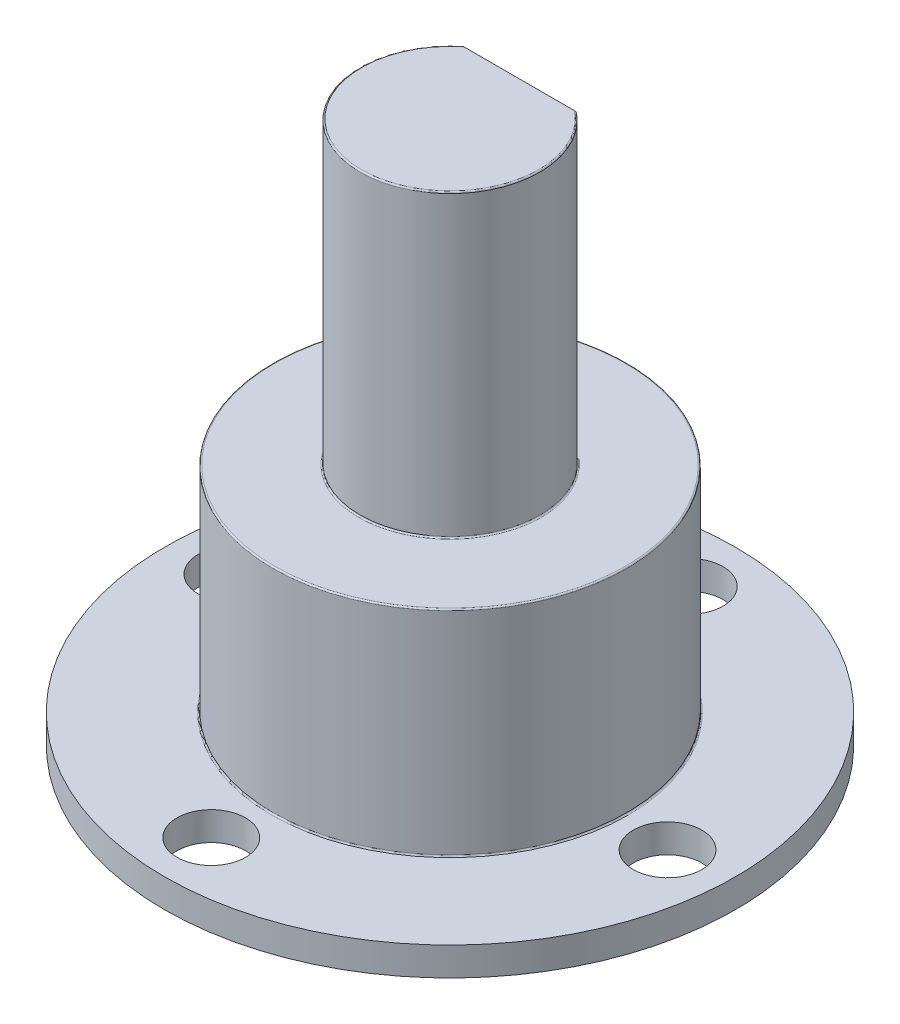
ISO-10303-21;
HEADER;
FILE_DESCRIPTION(('STEP AP214'),'2;1');
FILE_NAME('part.step','',(''),(''),'','','');
FILE_SCHEMA(('AUTOMOTIVE_DESIGN { 1 0 10303 214 1 1 1 1 }'));
ENDSEC;
DATA;
#1=APPLICATION_CONTEXT('core data for automotive mechanical design processes');
#2=APPLICATION_PROTOCOL_DEFINITION('international standard','automotive_design',2000,#1);
#3=PRODUCT_CONTEXT('',#1,'mechanical');
#4=PRODUCT('Part','Part','',(#3));
#5=PRODUCT_RELATED_PRODUCT_CATEGORY('part','',(#4));
#6=PRODUCT_DEFINITION_FORMATION('','',#4);
#7=PRODUCT_DEFINITION_CONTEXT('part definition',#1,'design');
#8=PRODUCT_DEFINITION('design','',#6,#7);
#9=PRODUCT_DEFINITION_SHAPE('','',#8);
#10=(LENGTH_UNIT() NAMED_UNIT(*) SI_UNIT(.MILLI.,.METRE.));
#11=(NAMED_UNIT(*) PLANE_ANGLE_UNIT() SI_UNIT($,.RADIAN.));
#12=(NAMED_UNIT(*) SI_UNIT($,.STERADIAN.) SOLID_ANGLE_UNIT());
#13=UNCERTAINTY_MEASURE_WITH_UNIT(LENGTH_MEASURE(1.E-05),#10,'distance_accuracy_value','');
#14=(GEOMETRIC_REPRESENTATION_CONTEXT(3) GLOBAL_UNCERTAINTY_ASSIGNED_CONTEXT((#13)) GLOBAL_UNIT_ASSIGNED_CONTEXT((#10,
#11,#12)) REPRESENTATION_CONTEXT('',''));
#15=CARTESIAN_POINT('',(0.,0.,0.));
#16=DIRECTION('',(0.,0.,1.));
#17=DIRECTION('',(1.,0.,0.));
#18=AXIS2_PLACEMENT_3D('',#15,#16,#17);
#19=CARTESIAN_POINT('',(0.,19.,0.));
#20=DIRECTION('',(0.,1.,0.));
#21=DIRECTION('',(0.,0.,1.));
#22=AXIS2_PLACEMENT_3D('',#19,#20,#21);
#23=PLANE('',#22);
#24=DIRECTION('',(1.,0.,0.));
#25=VECTOR('',#24,1.);
#26=CARTESIAN_POINT('',(-3.64134224162171,19.,-2.42190413345966));
#27=LINE('',#26,#25);
#28=CARTESIAN_POINT('',(-1.93504014643908,19.,-2.42190413345966));
#29=VERTEX_POINT('',#28);
#30=CARTESIAN_POINT('',(1.93504014643908,19.,-2.42190413345966));
#31=VERTEX_POINT('',#30);
#32=EDGE_CURVE('E197',#29,#31,#27,.T.);
#33=ORIENTED_EDGE('',*,*,#32,.F.);
#34=CARTESIAN_POINT('',(0.,19.,0.));
#35=DIRECTION('',(0.,1.,0.));
#36=DIRECTION('',(0.,0.,1.));
#37=AXIS2_PLACEMENT_3D('',#34,#35,#36);
#38=CIRCLE('',#37,3.1);
#39=EDGE_CURVE('E264',#29,#31,#38,.T.);
#40=ORIENTED_EDGE('',*,*,#39,.T.);
#41=EDGE_LOOP('',(#33,#40));
#42=FACE_BOUND('',#41,.T.);
#43=ADVANCED_FACE('F33',(#42),#23,.T.);
#44=CARTESIAN_POINT('',(0.,5.,0.));
#45=DIRECTION('',(0.,-1.,0.));
#46=DIRECTION('',(0.,0.,-1.));
#47=AXIS2_PLACEMENT_3D('',#44,#45,#46);
#48=CYLINDRICAL_SURFACE('',#47,3.15);
#49=DIRECTION('',(0.,-1.,0.));
#50=VECTOR('',#49,1.);
#51=CARTESIAN_POINT('',(2.01416989559744,5.,-2.42190413345966));
#52=LINE('',#51,#50);
#53=CARTESIAN_POINT('',(2.01416989559744,18.95,-2.42190413345966));
#54=VERTEX_POINT('',#53);
#55=CARTESIAN_POINT('',(2.01416989559744,8.55,-2.42190413345966));
#56=VERTEX_POINT('',#55);
#57=EDGE_CURVE('E91',#54,#56,#52,.T.);
#58=ORIENTED_EDGE('',*,*,#57,.F.);
#59=CARTESIAN_POINT('',(0.,18.95,0.));
#60=DIRECTION('',(0.,1.,0.));
#61=DIRECTION('',(0.,0.,1.));
#62=AXIS2_PLACEMENT_3D('',#59,#60,#61);
#63=CIRCLE('',#62,3.15);
#64=CARTESIAN_POINT('',(-2.01416989559744,18.95,-2.42190413345966));
#65=VERTEX_POINT('',#64);
#66=EDGE_CURVE('E89',#54,#65,#63,.F.);
#67=ORIENTED_EDGE('',*,*,#66,.T.);
#68=DIRECTION('',(0.,-1.,0.));
#69=VECTOR('',#68,1.);
#70=CARTESIAN_POINT('',(-2.01416989559744,5.,-2.42190413345966));
#71=LINE('',#70,#69);
#72=CARTESIAN_POINT('',(-2.01416989559744,8.55,-2.42190413345966));
#73=VERTEX_POINT('',#72);
#74=EDGE_CURVE('E77',#73,#65,#71,.F.);
#75=ORIENTED_EDGE('',*,*,#74,.F.);
#76=CARTESIAN_POINT('',(0.,8.55,0.));
#77=DIRECTION('',(0.,1.,0.));
#78=DIRECTION('',(0.,0.,1.));
#79=AXIS2_PLACEMENT_3D('',#76,#77,#78);
#80=CIRCLE('',#79,3.15);
#81=EDGE_CURVE('E86',#73,#56,#80,.T.);
#82=ORIENTED_EDGE('',*,*,#81,.T.);
#83=EDGE_LOOP('',(#58,#67,#75,#82));
#84=FACE_BOUND('',#83,.T.);
#85=ADVANCED_FACE('F85',(#84),#48,.T.);
#86=CARTESIAN_POINT('',(3.15,8.5,0.));
#87=DIRECTION('',(0.,1.,0.));
#88=DIRECTION('',(0.,0.,1.));
#89=AXIS2_PLACEMENT_3D('',#86,#87,#88);
#90=PLANE('',#89);
#91=CARTESIAN_POINT('',(0.,8.5,0.));
#92=DIRECTION('',(0.,1.,0.));
#93=DIRECTION('',(0.,0.,1.));
#94=AXIS2_PLACEMENT_3D('',#91,#92,#93);
#95=CIRCLE('',#94,6.15);
#96=CARTESIAN_POINT('',(0.,8.5,6.15));
#97=VERTEX_POINT('',#96);
#98=EDGE_CURVE('E265',#97,#97,#95,.T.);
#99=ORIENTED_EDGE('',*,*,#98,.T.);
#100=EDGE_LOOP('',(#99));
#101=FACE_BOUND('',#100,.T.);
#102=CARTESIAN_POINT('',(0.,8.5,0.));
#103=DIRECTION('',(0.,1.,0.));
#104=DIRECTION('',(0.,0.,1.));
#105=AXIS2_PLACEMENT_3D('',#102,#103,#104);
#106=CIRCLE('',#105,3.2);
#107=CARTESIAN_POINT('',(2.09150194079063,8.5,-2.42190413345966));
#108=VERTEX_POINT('',#107);
#109=CARTESIAN_POINT('',(-2.09150194079063,8.5,-2.42190413345966));
#110=VERTEX_POINT('',#109);
#111=EDGE_CURVE('E267',#108,#110,#106,.F.);
#112=ORIENTED_EDGE('',*,*,#111,.T.);
#113=DIRECTION('',(-1.,0.,0.));
#114=VECTOR('',#113,1.);
#115=CARTESIAN_POINT('',(-3.64134224162171,8.5,-2.42190413345966));
#116=LINE('',#115,#114);
#117=EDGE_CURVE('E53',#108,#110,#116,.T.);
#118=ORIENTED_EDGE('',*,*,#117,.F.);
#119=EDGE_LOOP('',(#112,#118));
#120=FACE_BOUND('',#119,.T.);
#121=ADVANCED_FACE('F153',(#101,#120),#90,.T.);
#122=CARTESIAN_POINT('',(0.,5.,0.));
#123=DIRECTION('',(0.,-1.,0.));
#124=DIRECTION('',(0.,0.,-1.));
#125=AXIS2_PLACEMENT_3D('',#122,#123,#124);
#126=CYLINDRICAL_SURFACE('',#125,6.2);
#127=CARTESIAN_POINT('',(0.,8.45,0.));
#128=DIRECTION('',(0.,1.,0.));
#129=DIRECTION('',(0.,0.,1.));
#130=AXIS2_PLACEMENT_3D('',#127,#128,#129);
#131=CIRCLE('',#130,6.2);
#132=CARTESIAN_POINT('',(0.,8.45,6.2));
#133=VERTEX_POINT('',#132);
#134=EDGE_CURVE('E273',#133,#133,#131,.F.);
#135=ORIENTED_EDGE('',*,*,#134,.T.);
#136=EDGE_LOOP('',(#135));
#137=FACE_BOUND('',#136,.T.);
#138=CARTESIAN_POINT('',(0.,1.05,0.));
#139=DIRECTION('',(0.,1.,0.));
#140=DIRECTION('',(0.,0.,1.));
#141=AXIS2_PLACEMENT_3D('',#138,#139,#140);
#142=CIRCLE('',#141,6.2);
#143=CARTESIAN_POINT('',(0.,1.05,6.2));
#144=VERTEX_POINT('',#143);
#145=EDGE_CURVE('E271',#144,#144,#142,.T.);
#146=ORIENTED_EDGE('',*,*,#145,.T.);
#147=EDGE_LOOP('',(#146));
#148=FACE_BOUND('',#147,.T.);
#149=ADVANCED_FACE('F159',(#137,#148),#126,.T.);
#150=CARTESIAN_POINT('',(6.2,1.,0.));
#151=DIRECTION('',(0.,1.,0.));
#152=DIRECTION('',(0.,0.,1.));
#153=AXIS2_PLACEMENT_3D('',#150,#151,#152);
#154=PLANE('',#153);
#155=CARTESIAN_POINT('',(0.,1.,0.));
#156=DIRECTION('',(0.,1.,0.));
#157=DIRECTION('',(0.,0.,1.));
#158=AXIS2_PLACEMENT_3D('',#155,#156,#157);
#159=CIRCLE('',#158,6.25);
#160=CARTESIAN_POINT('',(0.,1.,6.25));
#161=VERTEX_POINT('',#160);
#162=EDGE_CURVE('E81',#161,#161,#159,.F.);
#163=ORIENTED_EDGE('',*,*,#162,.T.);
#164=EDGE_LOOP('',(#163));
#165=FACE_BOUND('',#164,.T.);
#166=CARTESIAN_POINT('',(-7.99137872735473,1.,-0.371303159133185));
#167=DIRECTION('',(0.,1.,0.));
#168=DIRECTION('',(0.,0.,1.));
#169=AXIS2_PLACEMENT_3D('',#166,#167,#168);
#170=CIRCLE('',#169,1.2);
#171=CARTESIAN_POINT('',(-7.99137872735473,1.,0.828696840866815));
#172=VERTEX_POINT('',#171);
#173=EDGE_CURVE('E222',#172,#172,#170,.T.);
#174=ORIENTED_EDGE('',*,*,#173,.F.);
#175=EDGE_LOOP('',(#174));
#176=FACE_BOUND('',#175,.T.);
#177=CARTESIAN_POINT('',(-0.371303159133101,1.,7.99137872735473));
#178=DIRECTION('',(0.,1.,0.));
#179=DIRECTION('',(0.,0.,1.));
#180=AXIS2_PLACEMENT_3D('',#177,#178,#179);
#181=CIRCLE('',#180,1.2);
#182=CARTESIAN_POINT('',(-0.371303159133101,1.,9.19137872735473));
#183=VERTEX_POINT('',#182);
#184=EDGE_CURVE('E216',#183,#183,#181,.T.);
#185=ORIENTED_EDGE('',*,*,#184,.F.);
#186=EDGE_LOOP('',(#185));
#187=FACE_BOUND('',#186,.T.);
#188=CARTESIAN_POINT('',(7.99137872735473,1.,0.371303159133129));
#189=DIRECTION('',(0.,1.,0.));
#190=DIRECTION('',(0.,0.,1.));
#191=AXIS2_PLACEMENT_3D('',#188,#189,#190);
#192=CIRCLE('',#191,1.2);
#193=CARTESIAN_POINT('',(7.99137872735473,1.,1.57130315913313));
#194=VERTEX_POINT('',#193);
#195=EDGE_CURVE('E210',#194,#194,#192,.T.);
#196=ORIENTED_EDGE('',*,*,#195,.F.);
#197=EDGE_LOOP('',(#196));
#198=FACE_BOUND('',#197,.T.);
#199=CARTESIAN_POINT('',(0.371303159133101,1.,-7.99137872735473));
#200=DIRECTION('',(0.,1.,0.));
#201=DIRECTION('',(0.,0.,1.));
#202=AXIS2_PLACEMENT_3D('',#199,#200,#201);
#203=CIRCLE('',#202,1.2);
#204=CARTESIAN_POINT('',(0.371303159133101,1.,-6.79137872735473));
#205=VERTEX_POINT('',#204);
#206=EDGE_CURVE('E204',#205,#205,#203,.T.);
#207=ORIENTED_EDGE('',*,*,#206,.F.);
#208=EDGE_LOOP('',(#207));
#209=FACE_BOUND('',#208,.T.);
#210=CARTESIAN_POINT('',(0.,1.,0.));
#211=DIRECTION('',(0.,-1.,0.));
#212=DIRECTION('',(0.,0.,-1.));
#213=AXIS2_PLACEMENT_3D('',#210,#211,#212);
#214=CIRCLE('',#213,10.);
#215=CARTESIAN_POINT('',(0.,1.,-10.));
#216=VERTEX_POINT('',#215);
#217=EDGE_CURVE('E95',#216,#216,#214,.T.);
#218=ORIENTED_EDGE('',*,*,#217,.F.);
#219=EDGE_LOOP('',(#218));
#220=FACE_BOUND('',#219,.T.);
#221=ADVANCED_FACE('F163',(#165,#176,#187,#198,#209,#220),#154,.T.);
#222=CARTESIAN_POINT('',(0.,5.,0.));
#223=DIRECTION('',(0.,-1.,0.));
#224=DIRECTION('',(0.,0.,-1.));
#225=AXIS2_PLACEMENT_3D('',#222,#223,#224);
#226=CYLINDRICAL_SURFACE('',#225,10.);
#227=ORIENTED_EDGE('',*,*,#217,.T.);
#228=EDGE_LOOP('',(#227));
#229=FACE_BOUND('',#228,.T.);
#230=CARTESIAN_POINT('',(0.,0.,0.));
#231=DIRECTION('',(0.,-1.,0.));
#232=DIRECTION('',(0.,0.,-1.));
#233=AXIS2_PLACEMENT_3D('',#230,#231,#232);
#234=CIRCLE('',#233,10.);
#235=CARTESIAN_POINT('',(0.,0.,-10.));
#236=VERTEX_POINT('',#235);
#237=EDGE_CURVE('E100',#236,#236,#234,.T.);
#238=ORIENTED_EDGE('',*,*,#237,.F.);
#239=EDGE_LOOP('',(#238));
#240=FACE_BOUND('',#239,.T.);
#241=ADVANCED_FACE('F167',(#229,#240),#226,.T.);
#242=CARTESIAN_POINT('',(10.,0.,0.));
#243=DIRECTION('',(0.,-1.,0.));
#244=DIRECTION('',(0.,0.,-1.));
#245=AXIS2_PLACEMENT_3D('',#242,#243,#244);
#246=PLANE('',#245);
#247=CARTESIAN_POINT('',(-7.99137872735473,0.,-0.371303159133185));
#248=DIRECTION('',(0.,-1.,0.));
#249=DIRECTION('',(0.,0.,-1.));
#250=AXIS2_PLACEMENT_3D('',#247,#248,#249);
#251=CIRCLE('',#250,1.2);
#252=CARTESIAN_POINT('',(-7.99137872735473,0.,-1.57130315913318));
#253=VERTEX_POINT('',#252);
#254=EDGE_CURVE('E219',#253,#253,#251,.T.);
#255=ORIENTED_EDGE('',*,*,#254,.F.);
#256=EDGE_LOOP('',(#255));
#257=FACE_BOUND('',#256,.T.);
#258=CARTESIAN_POINT('',(-0.371303159133101,0.,7.99137872735473));
#259=DIRECTION('',(0.,-1.,0.));
#260=DIRECTION('',(0.,0.,-1.));
#261=AXIS2_PLACEMENT_3D('',#258,#259,#260);
#262=CIRCLE('',#261,1.2);
#263=CARTESIAN_POINT('',(-0.371303159133101,0.,6.79137872735473));
#264=VERTEX_POINT('',#263);
#265=EDGE_CURVE('E213',#264,#264,#262,.T.);
#266=ORIENTED_EDGE('',*,*,#265,.F.);
#267=EDGE_LOOP('',(#266));
#268=FACE_BOUND('',#267,.T.);
#269=CARTESIAN_POINT('',(7.99137872735473,0.,0.371303159133129));
#270=DIRECTION('',(0.,-1.,0.));
#271=DIRECTION('',(0.,0.,-1.));
#272=AXIS2_PLACEMENT_3D('',#269,#270,#271);
#273=CIRCLE('',#272,1.2);
#274=CARTESIAN_POINT('',(7.99137872735473,0.,-0.82869684086687));
#275=VERTEX_POINT('',#274);
#276=EDGE_CURVE('E207',#275,#275,#273,.T.);
#277=ORIENTED_EDGE('',*,*,#276,.F.);
#278=EDGE_LOOP('',(#277));
#279=FACE_BOUND('',#278,.T.);
#280=CARTESIAN_POINT('',(0.371303159133101,0.,-7.99137872735473));
#281=DIRECTION('',(0.,-1.,0.));
#282=DIRECTION('',(0.,0.,-1.));
#283=AXIS2_PLACEMENT_3D('',#280,#281,#282);
#284=CIRCLE('',#283,1.2);
#285=CARTESIAN_POINT('',(0.371303159133101,0.,-9.19137872735473));
#286=VERTEX_POINT('',#285);
#287=EDGE_CURVE('E200',#286,#286,#284,.T.);
#288=ORIENTED_EDGE('',*,*,#287,.F.);
#289=EDGE_LOOP('',(#288));
#290=FACE_BOUND('',#289,.T.);
#291=ORIENTED_EDGE('',*,*,#237,.T.);
#292=EDGE_LOOP('',(#291));
#293=FACE_BOUND('',#292,.T.);
#294=CARTESIAN_POINT('',(0.,0.,0.));
#295=DIRECTION('',(0.,-1.,0.));
#296=DIRECTION('',(0.,0.,-1.));
#297=AXIS2_PLACEMENT_3D('',#294,#295,#296);
#298=CIRCLE('',#297,4.5);
#299=CARTESIAN_POINT('',(0.,0.,-4.5));
#300=VERTEX_POINT('',#299);
#301=EDGE_CURVE('E185',#300,#300,#298,.T.);
#302=ORIENTED_EDGE('',*,*,#301,.F.);
#303=EDGE_LOOP('',(#302));
#304=FACE_BOUND('',#303,.T.);
#305=ADVANCED_FACE('F171',(#257,#268,#279,#290,#293,#304),#246,.T.);
#306=CARTESIAN_POINT('',(0.,5.,0.));
#307=DIRECTION('',(0.,-1.,0.));
#308=DIRECTION('',(0.,0.,-1.));
#309=AXIS2_PLACEMENT_3D('',#306,#307,#308);
#310=CYLINDRICAL_SURFACE('',#309,4.5);
#311=ORIENTED_EDGE('',*,*,#301,.T.);
#312=EDGE_LOOP('',(#311));
#313=FACE_BOUND('',#312,.T.);
#314=CARTESIAN_POINT('',(0.,5.,0.));
#315=DIRECTION('',(0.,-1.,0.));
#316=DIRECTION('',(0.,0.,-1.));
#317=AXIS2_PLACEMENT_3D('',#314,#315,#316);
#318=CIRCLE('',#317,4.5);
#319=CARTESIAN_POINT('',(0.,5.,-4.5));
#320=VERTEX_POINT('',#319);
#321=EDGE_CURVE('E90',#320,#320,#318,.T.);
#322=ORIENTED_EDGE('',*,*,#321,.F.);
#323=EDGE_LOOP('',(#322));
#324=FACE_BOUND('',#323,.T.);
#325=ADVANCED_FACE('F174',(#313,#324),#310,.F.);
#326=CARTESIAN_POINT('',(4.5,5.,0.));
#327=DIRECTION('',(0.,-1.,0.));
#328=DIRECTION('',(0.,0.,-1.));
#329=AXIS2_PLACEMENT_3D('',#326,#327,#328);
#330=PLANE('',#329);
#331=ORIENTED_EDGE('',*,*,#321,.T.);
#332=EDGE_LOOP('',(#331));
#333=FACE_BOUND('',#332,.T.);
#334=ADVANCED_FACE('F124',(#333),#330,.T.);
#335=CARTESIAN_POINT('',(-3.64134224162171,1.7776982286854,-2.42190413345966));
#336=DIRECTION('',(0.,0.,1.));
#337=DIRECTION('',(1.,0.,0.));
#338=AXIS2_PLACEMENT_3D('',#335,#336,#337);
#339=PLANE('',#338);
#340=ORIENTED_EDGE('',*,*,#74,.T.);
#341=CARTESIAN_POINT('',(-2.01416989559744,18.95,-2.42190413345966));
#342=CARTESIAN_POINT('',(-2.01417590237611,18.9521216830641,-2.42190413345966));
#343=CARTESIAN_POINT('',(-2.01395911672371,18.9542362565048,-2.42190413345966));
#344=CARTESIAN_POINT('',(-2.01313385755975,18.9583653469993,-2.42190413345966));
#345=CARTESIAN_POINT('',(-2.01252956095126,18.9603806871485,-2.42190413345966));
#346=CARTESIAN_POINT('',(-2.01098410194977,18.9642657850124,-2.42190413345966));
#347=CARTESIAN_POINT('',(-2.0100442207675,18.9661360639363,-2.42190413345966));
#348=CARTESIAN_POINT('',(-2.00789099026722,18.9697159538891,-2.42190413345966));
#349=CARTESIAN_POINT('',(-2.00667687582769,18.9714250960574,-2.42190413345966));
#350=CARTESIAN_POINT('',(-2.00338506976665,18.9754672746997,-2.42190413345966));
#351=CARTESIAN_POINT('',(-2.00117643251855,18.9776934145825,-2.42190413345966));
#352=CARTESIAN_POINT('',(-1.99643926205854,18.9817710648431,-2.42190413345966));
#353=CARTESIAN_POINT('',(-1.99391010489922,18.9836218256981,-2.42190413345966));
#354=CARTESIAN_POINT('',(-1.98725433870058,18.9878621134624,-2.42190413345966));
#355=CARTESIAN_POINT('',(-1.98298472824473,18.9900262882537,-2.42190413345966));
#356=CARTESIAN_POINT('',(-1.9741603474674,18.9936763378202,-2.42190413345966));
#357=CARTESIAN_POINT('',(-1.96960467061184,18.9951599182598,-2.42190413345966));
#358=CARTESIAN_POINT('',(-1.96006551370825,18.9975952002509,-2.42190413345966));
#359=CARTESIAN_POINT('',(-1.95507274239813,18.99850978958,-2.42190413345966));
#360=CARTESIAN_POINT('',(-1.94506350299754,18.9997060938125,-2.42190413345966));
#361=CARTESIAN_POINT('',(-1.9400478224935,18.9999942970851,-2.42190413345966));
#362=CARTESIAN_POINT('',(-1.93504014643969,19.0000000000024,-2.42190413345966));
#363=B_SPLINE_CURVE_WITH_KNOTS('',3,(#341,#342,#343,#344,#345,#346,#347,#348,#349,#350,#351,
#352,#353,#354,#355,#356,#357,#358,#359,#360,#361,#362),.UNSPECIFIED.,.F.,.F.,(4,2,2,2,2,2,2,2,
2,2,4),(0.,0.00634273226889814,0.012618221112652,0.0188700028781376,0.0251394476725693,
0.0344942343102322,0.0438675197383147,0.0581489993796762,0.0724782754562997,0.0876644527897368,
0.102692560360126),.UNSPECIFIED.);
#364=EDGE_CURVE('E110',#65,#29,#363,.T.);
#365=ORIENTED_EDGE('',*,*,#364,.T.);
#366=ORIENTED_EDGE('',*,*,#32,.T.);
#367=CARTESIAN_POINT('',(1.93504014643908,19.,-2.42190413345966));
#368=CARTESIAN_POINT('',(1.9418884795616,18.9999797110995,-2.42190413345966));
#369=CARTESIAN_POINT('',(1.94878601283452,18.9994465858052,-2.42190413345966));
#370=CARTESIAN_POINT('',(1.96246409628458,18.9971729364779,-2.42190413345966));
#371=CARTESIAN_POINT('',(1.96924200411268,18.9954169846787,-2.42190413345966));
#372=CARTESIAN_POINT('',(1.97919852531104,18.9916661012743,-2.42190413345966));
#373=CARTESIAN_POINT('',(1.98256612796618,18.9901750768464,-2.42190413345966));
#374=CARTESIAN_POINT('',(1.98906382882479,18.9867535648226,-2.42190413345966));
#375=CARTESIAN_POINT('',(1.99219464353367,18.9848244800279,-2.42190413345966));
#376=CARTESIAN_POINT('',(1.99742140895632,18.9809695256451,-2.42190413345966));
#377=CARTESIAN_POINT('',(1.99959044883741,18.9791434441421,-2.42190413345966));
#378=CARTESIAN_POINT('',(2.00362038574404,18.9751743375611,-2.42190413345966));
#379=CARTESIAN_POINT('',(2.00548166137603,18.9730317081357,-2.42190413345966));
#380=CARTESIAN_POINT('',(2.00833837363689,18.9690311411295,-2.42190413345966));
#381=CARTESIAN_POINT('',(2.00943306007168,18.9672443976272,-2.42190413345966));
#382=CARTESIAN_POINT('',(2.01131803815089,18.9635193981071,-2.42190413345966));
#383=CARTESIAN_POINT('',(2.01210914155116,18.9615815630485,-2.42190413345966));
#384=CARTESIAN_POINT('',(2.0131912573456,18.9580408347422,-2.42190413345966));
#385=CARTESIAN_POINT('',(2.01355455656631,18.9564600043746,-2.42190413345966));
#386=CARTESIAN_POINT('',(2.01404561838081,18.9532537312903,-2.42190413345966));
#387=CARTESIAN_POINT('',(2.01417209676778,18.9516280935668,-2.42190413345966));
#388=CARTESIAN_POINT('',(2.01416989561043,18.950000000004,-2.42190413345966));
#389=B_SPLINE_CURVE_WITH_KNOTS('',3,(#367,#368,#369,#370,#371,#372,#373,#374,#375,#376,#377,
#378,#379,#380,#381,#382,#383,#384,#385,#386,#387,#388),.UNSPECIFIED.,.F.,.F.,(4,2,2,2,2,2,2,2,
2,2,4),(0.,0.0206100752579521,0.0414850024725544,0.0525079464908581,0.0634960774351003,
0.0719759123297831,0.0804452365862247,0.0867087405057899,0.0929553776568623,0.0978044445981582,
0.102679731233965),.UNSPECIFIED.);
#390=EDGE_CURVE('E97',#31,#54,#389,.T.);
#391=ORIENTED_EDGE('',*,*,#390,.T.);
#392=ORIENTED_EDGE('',*,*,#57,.T.);
#393=CARTESIAN_POINT('',(2.01416989559744,8.55,-2.42190413345966));
#394=CARTESIAN_POINT('',(2.01416375080115,8.54787045020707,-2.42190413345966));
#395=CARTESIAN_POINT('',(2.0143822432021,8.54574829513669,-2.42190413345966));
#396=CARTESIAN_POINT('',(2.0152130590764,8.54160525846304,-2.42190413345966));
#397=CARTESIAN_POINT('',(2.01582109365644,8.53958352924039,-2.42190413345966));
#398=CARTESIAN_POINT('',(2.0173745935777,8.53568665609457,-2.42190413345966));
#399=CARTESIAN_POINT('',(2.01831872381318,8.53381096746484,-2.42190413345966));
#400=CARTESIAN_POINT('',(2.02048009728128,8.53021999117104,-2.42190413345966));
#401=CARTESIAN_POINT('',(2.02169812443662,8.52850518433883,-2.42190413345966));
#402=CARTESIAN_POINT('',(2.02501346901599,8.52442992543303,-2.42190413345966));
#403=CARTESIAN_POINT('',(2.02724483126496,8.52217878225275,-2.42190413345966));
#404=CARTESIAN_POINT('',(2.03203085084424,8.51805424754571,-2.42190413345966));
#405=CARTESIAN_POINT('',(2.03458616786284,8.51618164764608,-2.42190413345966));
#406=CARTESIAN_POINT('',(2.04127117938197,8.51191746104592,-2.42190413345966));
#407=CARTESIAN_POINT('',(2.04554083701177,8.5097460011517,-2.42190413345966));
#408=CARTESIAN_POINT('',(2.05436646202734,8.50608737505192,-2.42190413345966));
#409=CARTESIAN_POINT('',(2.05892319370602,8.50460213154385,-2.42190413345966));
#410=CARTESIAN_POINT('',(2.06813792009235,8.50226696922212,-2.42190413345966));
#411=CARTESIAN_POINT('',(2.07279413682753,8.50140990907362,-2.42190413345966));
#412=CARTESIAN_POINT('',(2.08213608659994,8.50028128122227,-2.42190413345966));
#413=CARTESIAN_POINT('',(2.08682119893017,8.50000462558101,-2.42190413345966));
#414=CARTESIAN_POINT('',(2.09150194079008,8.49999999999782,-2.42190413345966));
#415=B_SPLINE_CURVE_WITH_KNOTS('',3,(#393,#394,#395,#396,#397,#398,#399,#400,#401,#402,#403,
#404,#405,#406,#407,#408,#409,#410,#411,#412,#413,#414),.UNSPECIFIED.,.F.,.F.,(4,2,2,2,2,2,2,2,
2,2,4),(0.,0.00636574946126845,0.0126625885841997,0.0189346882720301,0.0252249731858343,
0.0346804766431191,0.0441555538549263,0.0584475397049303,0.0727793307309555,0.0869455545208311,
0.100987066475824),.UNSPECIFIED.);
#416=EDGE_CURVE('E11',#56,#108,#415,.T.);
#417=ORIENTED_EDGE('',*,*,#416,.T.);
#418=ORIENTED_EDGE('',*,*,#117,.T.);
#419=CARTESIAN_POINT('',(-2.09150194079063,8.5,-2.42190413345966));
#420=CARTESIAN_POINT('',(-2.08511409521598,8.50001621423212,-2.42190413345966));
#421=CARTESIAN_POINT('',(-2.07869471576394,8.50052648826963,-2.42190413345966));
#422=CARTESIAN_POINT('',(-2.06596628688382,8.50264746767663,-2.42190413345966));
#423=CARTESIAN_POINT('',(-2.05965943695206,8.50427110274127,-2.42190413345966));
#424=CARTESIAN_POINT('',(-2.04994238179785,8.50783661385341,-2.42190413345966));
#425=CARTESIAN_POINT('',(-2.04638855644225,8.50938696380156,-2.42190413345966));
#426=CARTESIAN_POINT('',(-2.03954033704539,8.51297116439011,-2.42190413345966));
#427=CARTESIAN_POINT('',(-2.03624510969249,8.51500336930857,-2.42190413345966));
#428=CARTESIAN_POINT('',(-2.03089811026372,8.51898165874706,-2.42190413345966));
#429=CARTESIAN_POINT('',(-2.02875209764491,8.52080047405265,-2.42190413345966));
#430=CARTESIAN_POINT('',(-2.02476096129706,8.52474643740301,-2.42190413345966));
#431=CARTESIAN_POINT('',(-2.0229154902629,8.52687322410733,-2.42190413345966));
#432=CARTESIAN_POINT('',(-2.0200576708834,8.53086533674746,-2.42190413345966));
#433=CARTESIAN_POINT('',(-2.01895231407341,8.53266373673204,-2.42190413345966));
#434=CARTESIAN_POINT('',(-2.01704820175916,8.53641359302878,-2.42190413345966));
#435=CARTESIAN_POINT('',(-2.01624860618062,8.53836461197203,-2.42190413345966));
#436=CARTESIAN_POINT('',(-2.01515663114383,8.54192537983839,-2.42190413345966));
#437=CARTESIAN_POINT('',(-2.01479043508984,8.54351250936921,-2.42190413345966));
#438=CARTESIAN_POINT('',(-2.01429526220416,8.5467321056509,-2.42190413345966));
#439=CARTESIAN_POINT('',(-2.01416762156093,8.54836477609222,-2.42190413345966));
#440=CARTESIAN_POINT('',(-2.01416989559007,8.54999999999774,-2.42190413345966));
#441=B_SPLINE_CURVE_WITH_KNOTS('',3,(#419,#420,#421,#422,#423,#424,#425,#426,#427,#428,#429,
#430,#431,#432,#433,#434,#435,#436,#437,#438,#439,#440),.UNSPECIFIED.,.F.,.F.,(4,2,2,2,2,2,2,2,
2,2,4),(0.,0.0191992509703676,0.0386253292767722,0.0502276900527539,0.0617909809986993,
0.0702051651229693,0.0786095557605545,0.0849194969029147,0.0912119748389958,0.0960812340216025,
0.100977685931163),.UNSPECIFIED.);
#442=EDGE_CURVE('E47',#110,#73,#441,.T.);
#443=ORIENTED_EDGE('',*,*,#442,.T.);
#444=EDGE_LOOP('',(#340,#365,#366,#391,#392,#417,#418,#443));
#445=FACE_BOUND('',#444,.T.);
#446=ADVANCED_FACE('F76',(#445),#339,.F.);
#447=CARTESIAN_POINT('',(0.371303159133101,1.,-7.99137872735473));
#448=DIRECTION('',(0.,1.,0.));
#449=DIRECTION('',(0.,0.,1.));
#450=AXIS2_PLACEMENT_3D('',#447,#448,#449);
#451=CYLINDRICAL_SURFACE('',#450,1.2);
#452=ORIENTED_EDGE('',*,*,#206,.T.);
#453=EDGE_LOOP('',(#452));
#454=FACE_BOUND('',#453,.T.);
#455=ORIENTED_EDGE('',*,*,#287,.T.);
#456=EDGE_LOOP('',(#455));
#457=FACE_BOUND('',#456,.T.);
#458=ADVANCED_FACE('F123',(#454,#457),#451,.F.);
#459=CARTESIAN_POINT('',(7.99137872735473,1.,0.371303159133129));
#460=DIRECTION('',(0.,1.,0.));
#461=DIRECTION('',(0.,0.,1.));
#462=AXIS2_PLACEMENT_3D('',#459,#460,#461);
#463=CYLINDRICAL_SURFACE('',#462,1.2);
#464=ORIENTED_EDGE('',*,*,#195,.T.);
#465=EDGE_LOOP('',(#464));
#466=FACE_BOUND('',#465,.T.);
#467=ORIENTED_EDGE('',*,*,#276,.T.);
#468=EDGE_LOOP('',(#467));
#469=FACE_BOUND('',#468,.T.);
#470=ADVANCED_FACE('F240',(#466,#469),#463,.F.);
#471=CARTESIAN_POINT('',(-0.371303159133101,1.,7.99137872735473));
#472=DIRECTION('',(0.,1.,0.));
#473=DIRECTION('',(0.,0.,1.));
#474=AXIS2_PLACEMENT_3D('',#471,#472,#473);
#475=CYLINDRICAL_SURFACE('',#474,1.2);
#476=ORIENTED_EDGE('',*,*,#184,.T.);
#477=EDGE_LOOP('',(#476));
#478=FACE_BOUND('',#477,.T.);
#479=ORIENTED_EDGE('',*,*,#265,.T.);
#480=EDGE_LOOP('',(#479));
#481=FACE_BOUND('',#480,.T.);
#482=ADVANCED_FACE('F246',(#478,#481),#475,.F.);
#483=CARTESIAN_POINT('',(-7.99137872735473,1.,-0.371303159133185));
#484=DIRECTION('',(0.,1.,0.));
#485=DIRECTION('',(0.,0.,1.));
#486=AXIS2_PLACEMENT_3D('',#483,#484,#485);
#487=CYLINDRICAL_SURFACE('',#486,1.2);
#488=ORIENTED_EDGE('',*,*,#173,.T.);
#489=EDGE_LOOP('',(#488));
#490=FACE_BOUND('',#489,.T.);
#491=ORIENTED_EDGE('',*,*,#254,.T.);
#492=EDGE_LOOP('',(#491));
#493=FACE_BOUND('',#492,.T.);
#494=ADVANCED_FACE('F226',(#490,#493),#487,.F.);
#495=CARTESIAN_POINT('',(0.,18.95,0.));
#496=DIRECTION('',(0.,1.,0.));
#497=DIRECTION('',(0.,0.,1.));
#498=AXIS2_PLACEMENT_3D('',#495,#496,#497);
#499=TOROIDAL_SURFACE('',#498,3.1,0.05);
#500=ORIENTED_EDGE('',*,*,#390,.F.);
#501=ORIENTED_EDGE('',*,*,#39,.F.);
#502=ORIENTED_EDGE('',*,*,#364,.F.);
#503=ORIENTED_EDGE('',*,*,#66,.F.);
#504=EDGE_LOOP('',(#500,#501,#502,#503));
#505=FACE_BOUND('',#504,.T.);
#506=ADVANCED_FACE('F116',(#505),#499,.T.);
#507=CARTESIAN_POINT('',(0.,8.55,0.));
#508=DIRECTION('',(0.,1.,0.));
#509=DIRECTION('',(0.,0.,1.));
#510=AXIS2_PLACEMENT_3D('',#507,#508,#509);
#511=TOROIDAL_SURFACE('',#510,3.2,0.05);
#512=ORIENTED_EDGE('',*,*,#416,.F.);
#513=ORIENTED_EDGE('',*,*,#81,.F.);
#514=ORIENTED_EDGE('',*,*,#442,.F.);
#515=ORIENTED_EDGE('',*,*,#111,.F.);
#516=EDGE_LOOP('',(#512,#513,#514,#515));
#517=FACE_BOUND('',#516,.T.);
#518=ADVANCED_FACE('F94',(#517),#511,.F.);
#519=CARTESIAN_POINT('',(0.,8.45,0.));
#520=DIRECTION('',(0.,1.,0.));
#521=DIRECTION('',(0.,0.,1.));
#522=AXIS2_PLACEMENT_3D('',#519,#520,#521);
#523=TOROIDAL_SURFACE('',#522,6.15,0.05);
#524=ORIENTED_EDGE('',*,*,#98,.F.);
#525=EDGE_LOOP('',(#524));
#526=FACE_BOUND('',#525,.T.);
#527=ORIENTED_EDGE('',*,*,#134,.F.);
#528=EDGE_LOOP('',(#527));
#529=FACE_BOUND('',#528,.T.);
#530=ADVANCED_FACE('F138',(#526,#529),#523,.T.);
#531=CARTESIAN_POINT('',(0.,1.05,0.));
#532=DIRECTION('',(0.,1.,0.));
#533=DIRECTION('',(0.,0.,1.));
#534=AXIS2_PLACEMENT_3D('',#531,#532,#533);
#535=TOROIDAL_SURFACE('',#534,6.25,0.05);
#536=ORIENTED_EDGE('',*,*,#145,.F.);
#537=EDGE_LOOP('',(#536));
#538=FACE_BOUND('',#537,.T.);
#539=ORIENTED_EDGE('',*,*,#162,.F.);
#540=EDGE_LOOP('',(#539));
#541=FACE_BOUND('',#540,.T.);
#542=ADVANCED_FACE('F35',(#538,#541),#535,.F.);
#543=CLOSED_SHELL('',(#43,#85,#121,#149,#221,#241,#305,#325,#334,#446,#458,#470,#482,#494,#506,
#518,#530,#542));
#544=MANIFOLD_SOLID_BREP('B2',#543);
#545=ADVANCED_BREP_SHAPE_REPRESENTATION('',(#18,#544),#14);
#546=SHAPE_DEFINITION_REPRESENTATION(#9,#545);
ENDSEC;
END-ISO-10303-21;
